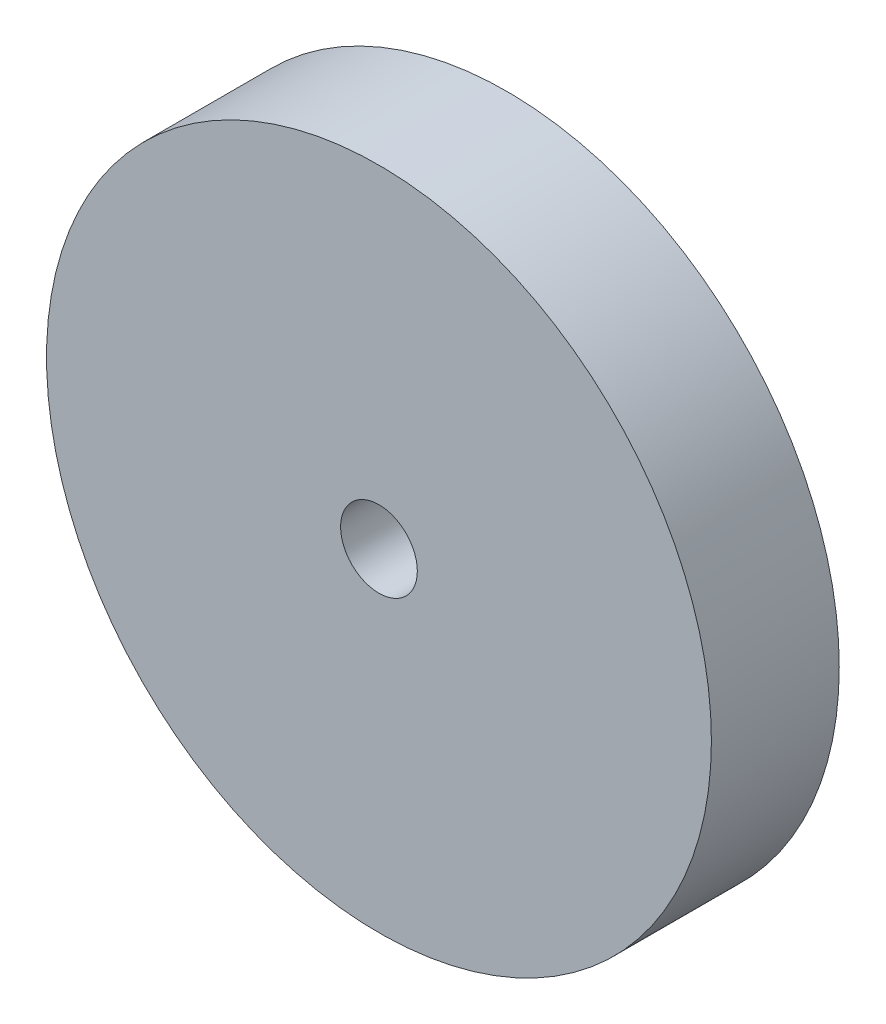
ISO-10303-21;
HEADER;
FILE_DESCRIPTION(('STEP AP214'),'2;1');
FILE_NAME('part.step','',(''),(''),'','','');
FILE_SCHEMA(('AUTOMOTIVE_DESIGN { 1 0 10303 214 1 1 1 1 }'));
ENDSEC;
DATA;
#1=APPLICATION_CONTEXT('core data for automotive mechanical design processes');
#2=APPLICATION_PROTOCOL_DEFINITION('international standard','automotive_design',2000,#1);
#3=PRODUCT_CONTEXT('',#1,'mechanical');
#4=PRODUCT('Part','Part','',(#3));
#5=PRODUCT_RELATED_PRODUCT_CATEGORY('part','',(#4));
#6=PRODUCT_DEFINITION_FORMATION('','',#4);
#7=PRODUCT_DEFINITION_CONTEXT('part definition',#1,'design');
#8=PRODUCT_DEFINITION('design','',#6,#7);
#9=PRODUCT_DEFINITION_SHAPE('','',#8);
#10=(LENGTH_UNIT() NAMED_UNIT(*) SI_UNIT(.MILLI.,.METRE.));
#11=(NAMED_UNIT(*) PLANE_ANGLE_UNIT() SI_UNIT($,.RADIAN.));
#12=(NAMED_UNIT(*) SI_UNIT($,.STERADIAN.) SOLID_ANGLE_UNIT());
#13=UNCERTAINTY_MEASURE_WITH_UNIT(LENGTH_MEASURE(1.E-05),#10,'distance_accuracy_value','');
#14=(GEOMETRIC_REPRESENTATION_CONTEXT(3) GLOBAL_UNCERTAINTY_ASSIGNED_CONTEXT((#13)) GLOBAL_UNIT_ASSIGNED_CONTEXT((#10,
#11,#12)) REPRESENTATION_CONTEXT('',''));
#15=CARTESIAN_POINT('',(0.,0.,0.));
#16=DIRECTION('',(0.,0.,1.));
#17=DIRECTION('',(1.,0.,0.));
#18=AXIS2_PLACEMENT_3D('',#15,#16,#17);
#19=CARTESIAN_POINT('',(0.,0.,10.));
#20=DIRECTION('',(0.,0.,1.));
#21=DIRECTION('',(1.,0.,0.));
#22=AXIS2_PLACEMENT_3D('',#19,#20,#21);
#23=PLANE('',#22);
#24=CARTESIAN_POINT('',(0.,0.,10.));
#25=DIRECTION('',(0.,0.,1.));
#26=DIRECTION('',(1.,0.,0.));
#27=AXIS2_PLACEMENT_3D('',#24,#25,#26);
#28=CIRCLE('',#27,26.);
#29=CARTESIAN_POINT('',(26.,0.,10.));
#30=VERTEX_POINT('',#29);
#31=EDGE_CURVE('E10',#30,#30,#28,.T.);
#32=ORIENTED_EDGE('',*,*,#31,.T.);
#33=EDGE_LOOP('',(#32));
#34=FACE_BOUND('',#33,.T.);
#35=CARTESIAN_POINT('',(0.,0.,10.));
#36=DIRECTION('',(0.,0.,1.));
#37=DIRECTION('',(1.,0.,0.));
#38=AXIS2_PLACEMENT_3D('',#35,#36,#37);
#39=CIRCLE('',#38,3.);
#40=CARTESIAN_POINT('',(3.,0.,10.));
#41=VERTEX_POINT('',#40);
#42=EDGE_CURVE('E52',#41,#41,#39,.T.);
#43=ORIENTED_EDGE('',*,*,#42,.F.);
#44=EDGE_LOOP('',(#43));
#45=FACE_BOUND('',#44,.T.);
#46=ADVANCED_FACE('F41',(#34,#45),#23,.T.);
#47=CARTESIAN_POINT('',(0.,0.,0.));
#48=DIRECTION('',(0.,0.,1.));
#49=DIRECTION('',(1.,0.,0.));
#50=AXIS2_PLACEMENT_3D('',#47,#48,#49);
#51=PLANE('',#50);
#52=CARTESIAN_POINT('',(0.,0.,0.));
#53=DIRECTION('',(0.,0.,1.));
#54=DIRECTION('',(1.,0.,0.));
#55=AXIS2_PLACEMENT_3D('',#52,#53,#54);
#56=CIRCLE('',#55,26.);
#57=CARTESIAN_POINT('',(26.,0.,0.));
#58=VERTEX_POINT('',#57);
#59=EDGE_CURVE('E45',#58,#58,#56,.T.);
#60=ORIENTED_EDGE('',*,*,#59,.F.);
#61=EDGE_LOOP('',(#60));
#62=FACE_BOUND('',#61,.T.);
#63=CARTESIAN_POINT('',(0.,0.,0.));
#64=DIRECTION('',(0.,0.,1.));
#65=DIRECTION('',(1.,0.,0.));
#66=AXIS2_PLACEMENT_3D('',#63,#64,#65);
#67=CIRCLE('',#66,3.);
#68=CARTESIAN_POINT('',(3.,0.,0.));
#69=VERTEX_POINT('',#68);
#70=EDGE_CURVE('E54',#69,#69,#67,.T.);
#71=ORIENTED_EDGE('',*,*,#70,.T.);
#72=EDGE_LOOP('',(#71));
#73=FACE_BOUND('',#72,.T.);
#74=ADVANCED_FACE('F64',(#62,#73),#51,.F.);
#75=CARTESIAN_POINT('',(0.,0.,10.));
#76=DIRECTION('',(0.,0.,-1.));
#77=DIRECTION('',(-1.,0.,0.));
#78=AXIS2_PLACEMENT_3D('',#75,#76,#77);
#79=CYLINDRICAL_SURFACE('',#78,26.);
#80=ORIENTED_EDGE('',*,*,#31,.F.);
#81=EDGE_LOOP('',(#80));
#82=FACE_BOUND('',#81,.T.);
#83=ORIENTED_EDGE('',*,*,#59,.T.);
#84=EDGE_LOOP('',(#83));
#85=FACE_BOUND('',#84,.T.);
#86=ADVANCED_FACE('F43',(#82,#85),#79,.T.);
#87=CARTESIAN_POINT('',(0.,0.,10.));
#88=DIRECTION('',(0.,0.,-1.));
#89=DIRECTION('',(-1.,0.,0.));
#90=AXIS2_PLACEMENT_3D('',#87,#88,#89);
#91=CYLINDRICAL_SURFACE('',#90,3.);
#92=ORIENTED_EDGE('',*,*,#42,.T.);
#93=EDGE_LOOP('',(#92));
#94=FACE_BOUND('',#93,.T.);
#95=ORIENTED_EDGE('',*,*,#70,.F.);
#96=EDGE_LOOP('',(#95));
#97=FACE_BOUND('',#96,.T.);
#98=ADVANCED_FACE('F60',(#94,#97),#91,.F.);
#99=CLOSED_SHELL('',(#46,#74,#86,#98));
#100=MANIFOLD_SOLID_BREP('B2',#99);
#101=ADVANCED_BREP_SHAPE_REPRESENTATION('',(#18,#100),#14);
#102=SHAPE_DEFINITION_REPRESENTATION(#9,#101);
ENDSEC;
END-ISO-10303-21;
